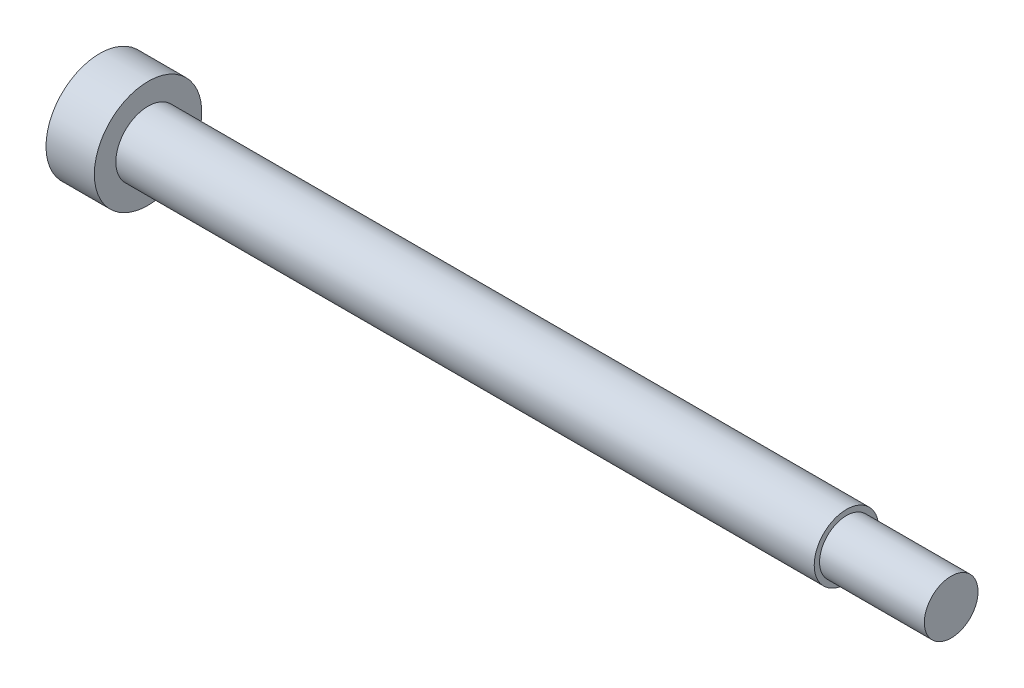
ISO-10303-21;
HEADER;
FILE_DESCRIPTION(('STEP AP214'),'2;1');
FILE_NAME('part.step','',(''),(''),'','','');
FILE_SCHEMA(('AUTOMOTIVE_DESIGN { 1 0 10303 214 1 1 1 1 }'));
ENDSEC;
DATA;
#1=APPLICATION_CONTEXT('core data for automotive mechanical design processes');
#2=APPLICATION_PROTOCOL_DEFINITION('international standard','automotive_design',2000,#1);
#3=PRODUCT_CONTEXT('',#1,'mechanical');
#4=PRODUCT('Part','Part','',(#3));
#5=PRODUCT_RELATED_PRODUCT_CATEGORY('part','',(#4));
#6=PRODUCT_DEFINITION_FORMATION('','',#4);
#7=PRODUCT_DEFINITION_CONTEXT('part definition',#1,'design');
#8=PRODUCT_DEFINITION('design','',#6,#7);
#9=PRODUCT_DEFINITION_SHAPE('','',#8);
#10=(LENGTH_UNIT() NAMED_UNIT(*) SI_UNIT(.MILLI.,.METRE.));
#11=(NAMED_UNIT(*) PLANE_ANGLE_UNIT() SI_UNIT($,.RADIAN.));
#12=(NAMED_UNIT(*) SI_UNIT($,.STERADIAN.) SOLID_ANGLE_UNIT());
#13=UNCERTAINTY_MEASURE_WITH_UNIT(LENGTH_MEASURE(1.E-05),#10,'distance_accuracy_value','');
#14=(GEOMETRIC_REPRESENTATION_CONTEXT(3) GLOBAL_UNCERTAINTY_ASSIGNED_CONTEXT((#13)) GLOBAL_UNIT_ASSIGNED_CONTEXT((#10,
#11,#12)) REPRESENTATION_CONTEXT('',''));
#15=CARTESIAN_POINT('',(0.,0.,0.));
#16=DIRECTION('',(0.,0.,1.));
#17=DIRECTION('',(1.,0.,0.));
#18=AXIS2_PLACEMENT_3D('',#15,#16,#17);
#19=CARTESIAN_POINT('',(0.,0.,0.));
#20=DIRECTION('',(1.,0.,0.));
#21=DIRECTION('',(0.,0.,-1.));
#22=AXIS2_PLACEMENT_3D('',#19,#20,#21);
#23=PLANE('',#22);
#24=DIRECTION('',(0.,-0.5,-0.866025403784439));
#25=VECTOR('',#24,1.);
#26=CARTESIAN_POINT('',(0.,2.88675134594813,0.));
#27=LINE('',#26,#25);
#28=CARTESIAN_POINT('',(0.,2.88675134594813,0.));
#29=VERTEX_POINT('',#28);
#30=CARTESIAN_POINT('',(0.,1.44337567297406,-2.5));
#31=VERTEX_POINT('',#30);
#32=EDGE_CURVE('E125',#29,#31,#27,.T.);
#33=ORIENTED_EDGE('',*,*,#32,.F.);
#34=DIRECTION('',(0.,0.5,-0.866025403784439));
#35=VECTOR('',#34,1.);
#36=CARTESIAN_POINT('',(0.,1.44337567297406,2.5));
#37=LINE('',#36,#35);
#38=CARTESIAN_POINT('',(0.,1.44337567297406,2.5));
#39=VERTEX_POINT('',#38);
#40=EDGE_CURVE('E51',#39,#29,#37,.T.);
#41=ORIENTED_EDGE('',*,*,#40,.F.);
#42=DIRECTION('',(0.,1.,0.));
#43=VECTOR('',#42,1.);
#44=CARTESIAN_POINT('',(0.,-1.44337567297407,2.5));
#45=LINE('',#44,#43);
#46=CARTESIAN_POINT('',(0.,-1.44337567297407,2.5));
#47=VERTEX_POINT('',#46);
#48=EDGE_CURVE('E134',#47,#39,#45,.T.);
#49=ORIENTED_EDGE('',*,*,#48,.F.);
#50=DIRECTION('',(0.,0.5,0.866025403784438));
#51=VECTOR('',#50,1.);
#52=CARTESIAN_POINT('',(0.,-2.88675134594813,0.));
#53=LINE('',#52,#51);
#54=CARTESIAN_POINT('',(0.,-2.88675134594813,0.));
#55=VERTEX_POINT('',#54);
#56=EDGE_CURVE('E132',#55,#47,#53,.T.);
#57=ORIENTED_EDGE('',*,*,#56,.F.);
#58=DIRECTION('',(0.,-0.5,0.866025403784439));
#59=VECTOR('',#58,1.);
#60=CARTESIAN_POINT('',(0.,-1.44337567297406,-2.5));
#61=LINE('',#60,#59);
#62=CARTESIAN_POINT('',(0.,-1.44337567297406,-2.5));
#63=VERTEX_POINT('',#62);
#64=EDGE_CURVE('E99',#63,#55,#61,.T.);
#65=ORIENTED_EDGE('',*,*,#64,.F.);
#66=DIRECTION('',(0.,-1.,0.));
#67=VECTOR('',#66,1.);
#68=CARTESIAN_POINT('',(0.,1.44337567297406,-2.5));
#69=LINE('',#68,#67);
#70=EDGE_CURVE('E128',#31,#63,#69,.T.);
#71=ORIENTED_EDGE('',*,*,#70,.F.);
#72=EDGE_LOOP('',(#33,#41,#49,#57,#65,#71));
#73=FACE_BOUND('',#72,.T.);
#74=CARTESIAN_POINT('',(0.,0.,0.));
#75=DIRECTION('',(-1.,0.,0.));
#76=DIRECTION('',(0.,0.,1.));
#77=AXIS2_PLACEMENT_3D('',#74,#75,#76);
#78=CIRCLE('',#77,5.);
#79=CARTESIAN_POINT('',(0.,0.,5.));
#80=VERTEX_POINT('',#79);
#81=EDGE_CURVE('E11',#80,#80,#78,.T.);
#82=ORIENTED_EDGE('',*,*,#81,.T.);
#83=EDGE_LOOP('',(#82));
#84=FACE_BOUND('',#83,.T.);
#85=ADVANCED_FACE('F37',(#73,#84),#23,.F.);
#86=CARTESIAN_POINT('',(0.,0.,0.));
#87=DIRECTION('',(-1.,0.,0.));
#88=DIRECTION('',(0.,0.,1.));
#89=AXIS2_PLACEMENT_3D('',#86,#87,#88);
#90=CYLINDRICAL_SURFACE('',#89,5.);
#91=ORIENTED_EDGE('',*,*,#81,.F.);
#92=EDGE_LOOP('',(#91));
#93=FACE_BOUND('',#92,.T.);
#94=CARTESIAN_POINT('',(4.5,0.,0.));
#95=DIRECTION('',(-1.,0.,0.));
#96=DIRECTION('',(0.,0.,1.));
#97=AXIS2_PLACEMENT_3D('',#94,#95,#96);
#98=CIRCLE('',#97,5.);
#99=CARTESIAN_POINT('',(4.5,0.,5.));
#100=VERTEX_POINT('',#99);
#101=EDGE_CURVE('E44',#100,#100,#98,.T.);
#102=ORIENTED_EDGE('',*,*,#101,.T.);
#103=EDGE_LOOP('',(#102));
#104=FACE_BOUND('',#103,.T.);
#105=ADVANCED_FACE('F157',(#93,#104),#90,.T.);
#106=CARTESIAN_POINT('',(4.5,5.,0.));
#107=DIRECTION('',(-1.,0.,0.));
#108=DIRECTION('',(0.,0.,1.));
#109=AXIS2_PLACEMENT_3D('',#106,#107,#108);
#110=PLANE('',#109);
#111=ORIENTED_EDGE('',*,*,#101,.F.);
#112=EDGE_LOOP('',(#111));
#113=FACE_BOUND('',#112,.T.);
#114=CARTESIAN_POINT('',(4.5,0.,0.));
#115=DIRECTION('',(-1.,0.,0.));
#116=DIRECTION('',(0.,0.,1.));
#117=AXIS2_PLACEMENT_3D('',#114,#115,#116);
#118=CIRCLE('',#117,3.);
#119=CARTESIAN_POINT('',(4.5,0.,3.));
#120=VERTEX_POINT('',#119);
#121=EDGE_CURVE('E152',#120,#120,#118,.T.);
#122=ORIENTED_EDGE('',*,*,#121,.T.);
#123=EDGE_LOOP('',(#122));
#124=FACE_BOUND('',#123,.T.);
#125=ADVANCED_FACE('F159',(#113,#124),#110,.F.);
#126=CARTESIAN_POINT('',(0.,0.,0.));
#127=DIRECTION('',(-1.,0.,0.));
#128=DIRECTION('',(0.,0.,1.));
#129=AXIS2_PLACEMENT_3D('',#126,#127,#128);
#130=CYLINDRICAL_SURFACE('',#129,3.);
#131=ORIENTED_EDGE('',*,*,#121,.F.);
#132=EDGE_LOOP('',(#131));
#133=FACE_BOUND('',#132,.T.);
#134=CARTESIAN_POINT('',(69.5,0.,0.));
#135=DIRECTION('',(-1.,0.,0.));
#136=DIRECTION('',(0.,0.,1.));
#137=AXIS2_PLACEMENT_3D('',#134,#135,#136);
#138=CIRCLE('',#137,3.);
#139=CARTESIAN_POINT('',(69.5,0.,3.));
#140=VERTEX_POINT('',#139);
#141=EDGE_CURVE('E149',#140,#140,#138,.T.);
#142=ORIENTED_EDGE('',*,*,#141,.T.);
#143=EDGE_LOOP('',(#142));
#144=FACE_BOUND('',#143,.T.);
#145=ADVANCED_FACE('F162',(#133,#144),#130,.T.);
#146=CARTESIAN_POINT('',(69.5,3.,0.));
#147=DIRECTION('',(-1.,0.,0.));
#148=DIRECTION('',(0.,0.,1.));
#149=AXIS2_PLACEMENT_3D('',#146,#147,#148);
#150=PLANE('',#149);
#151=ORIENTED_EDGE('',*,*,#141,.F.);
#152=EDGE_LOOP('',(#151));
#153=FACE_BOUND('',#152,.T.);
#154=CARTESIAN_POINT('',(69.5,0.,0.));
#155=DIRECTION('',(-1.,0.,0.));
#156=DIRECTION('',(0.,0.,1.));
#157=AXIS2_PLACEMENT_3D('',#154,#155,#156);
#158=CIRCLE('',#157,2.5);
#159=CARTESIAN_POINT('',(69.5,0.,2.5));
#160=VERTEX_POINT('',#159);
#161=EDGE_CURVE('E146',#160,#160,#158,.T.);
#162=ORIENTED_EDGE('',*,*,#161,.T.);
#163=EDGE_LOOP('',(#162));
#164=FACE_BOUND('',#163,.T.);
#165=ADVANCED_FACE('F168',(#153,#164),#150,.F.);
#166=CARTESIAN_POINT('',(0.,0.,0.));
#167=DIRECTION('',(-1.,0.,0.));
#168=DIRECTION('',(0.,0.,1.));
#169=AXIS2_PLACEMENT_3D('',#166,#167,#168);
#170=CYLINDRICAL_SURFACE('',#169,2.49999999999999);
#171=ORIENTED_EDGE('',*,*,#161,.F.);
#172=EDGE_LOOP('',(#171));
#173=FACE_BOUND('',#172,.T.);
#174=CARTESIAN_POINT('',(79.25,0.,0.));
#175=DIRECTION('',(-1.,0.,0.));
#176=DIRECTION('',(0.,0.,1.));
#177=AXIS2_PLACEMENT_3D('',#174,#175,#176);
#178=CIRCLE('',#177,2.49999999999999);
#179=CARTESIAN_POINT('',(79.25,0.,2.49999999999999));
#180=VERTEX_POINT('',#179);
#181=EDGE_CURVE('E138',#180,#180,#178,.T.);
#182=ORIENTED_EDGE('',*,*,#181,.T.);
#183=EDGE_LOOP('',(#182));
#184=FACE_BOUND('',#183,.T.);
#185=ADVANCED_FACE('F174',(#173,#184),#170,.T.);
#186=CARTESIAN_POINT('',(79.25,2.49999999999999,0.));
#187=DIRECTION('',(-1.,0.,0.));
#188=DIRECTION('',(0.,0.,1.));
#189=AXIS2_PLACEMENT_3D('',#186,#187,#188);
#190=PLANE('',#189);
#191=ORIENTED_EDGE('',*,*,#181,.F.);
#192=EDGE_LOOP('',(#191));
#193=FACE_BOUND('',#192,.T.);
#194=ADVANCED_FACE('F180',(#193),#190,.F.);
#195=CARTESIAN_POINT('',(3.,1.44337567297406,2.5));
#196=DIRECTION('',(0.,0.866025403784439,0.5));
#197=DIRECTION('',(0.,-0.5,0.866025403784439));
#198=AXIS2_PLACEMENT_3D('',#195,#196,#197);
#199=PLANE('',#198);
#200=ORIENTED_EDGE('',*,*,#40,.T.);
#201=DIRECTION('',(-1.,0.,0.));
#202=VECTOR('',#201,1.);
#203=CARTESIAN_POINT('',(3.,2.88675134594813,0.));
#204=LINE('',#203,#202);
#205=CARTESIAN_POINT('',(3.,2.88675134594813,0.));
#206=VERTEX_POINT('',#205);
#207=EDGE_CURVE('E81',#206,#29,#204,.T.);
#208=ORIENTED_EDGE('',*,*,#207,.F.);
#209=DIRECTION('',(0.,0.5,-0.866025403784439));
#210=VECTOR('',#209,1.);
#211=CARTESIAN_POINT('',(3.,1.44337567297406,2.5));
#212=LINE('',#211,#210);
#213=CARTESIAN_POINT('',(3.,1.44337567297406,2.5));
#214=VERTEX_POINT('',#213);
#215=EDGE_CURVE('E136',#214,#206,#212,.T.);
#216=ORIENTED_EDGE('',*,*,#215,.F.);
#217=DIRECTION('',(-1.,0.,0.));
#218=VECTOR('',#217,1.);
#219=CARTESIAN_POINT('',(3.,1.44337567297406,2.5));
#220=LINE('',#219,#218);
#221=EDGE_CURVE('E59',#214,#39,#220,.T.);
#222=ORIENTED_EDGE('',*,*,#221,.T.);
#223=EDGE_LOOP('',(#200,#208,#216,#222));
#224=FACE_BOUND('',#223,.T.);
#225=ADVANCED_FACE('F185',(#224),#199,.F.);
#226=CARTESIAN_POINT('',(3.,-1.44337567297407,2.5));
#227=DIRECTION('',(0.,0.,1.));
#228=DIRECTION('',(1.,0.,0.));
#229=AXIS2_PLACEMENT_3D('',#226,#227,#228);
#230=PLANE('',#229);
#231=ORIENTED_EDGE('',*,*,#48,.T.);
#232=ORIENTED_EDGE('',*,*,#221,.F.);
#233=DIRECTION('',(0.,1.,0.));
#234=VECTOR('',#233,1.);
#235=CARTESIAN_POINT('',(3.,-1.44337567297407,2.5));
#236=LINE('',#235,#234);
#237=CARTESIAN_POINT('',(3.,-1.44337567297407,2.5));
#238=VERTEX_POINT('',#237);
#239=EDGE_CURVE('E111',#238,#214,#236,.T.);
#240=ORIENTED_EDGE('',*,*,#239,.F.);
#241=DIRECTION('',(-1.,0.,0.));
#242=VECTOR('',#241,1.);
#243=CARTESIAN_POINT('',(3.,-1.44337567297407,2.5));
#244=LINE('',#243,#242);
#245=EDGE_CURVE('E103',#238,#47,#244,.T.);
#246=ORIENTED_EDGE('',*,*,#245,.T.);
#247=EDGE_LOOP('',(#231,#232,#240,#246));
#248=FACE_BOUND('',#247,.T.);
#249=ADVANCED_FACE('F190',(#248),#230,.F.);
#250=CARTESIAN_POINT('',(3.,-2.88675134594813,0.));
#251=DIRECTION('',(0.,-0.866025403784439,0.5));
#252=DIRECTION('',(0.,-0.5,-0.866025403784439));
#253=AXIS2_PLACEMENT_3D('',#250,#251,#252);
#254=PLANE('',#253);
#255=ORIENTED_EDGE('',*,*,#56,.T.);
#256=ORIENTED_EDGE('',*,*,#245,.F.);
#257=DIRECTION('',(0.,0.5,0.866025403784438));
#258=VECTOR('',#257,1.);
#259=CARTESIAN_POINT('',(3.,-2.88675134594813,0.));
#260=LINE('',#259,#258);
#261=CARTESIAN_POINT('',(3.,-2.88675134594813,0.));
#262=VERTEX_POINT('',#261);
#263=EDGE_CURVE('E107',#262,#238,#260,.T.);
#264=ORIENTED_EDGE('',*,*,#263,.F.);
#265=DIRECTION('',(-1.,0.,0.));
#266=VECTOR('',#265,1.);
#267=CARTESIAN_POINT('',(3.,-2.88675134594813,0.));
#268=LINE('',#267,#266);
#269=EDGE_CURVE('E92',#262,#55,#268,.T.);
#270=ORIENTED_EDGE('',*,*,#269,.T.);
#271=EDGE_LOOP('',(#255,#256,#264,#270));
#272=FACE_BOUND('',#271,.T.);
#273=ADVANCED_FACE('F108',(#272),#254,.F.);
#274=CARTESIAN_POINT('',(3.,-1.44337567297406,-2.5));
#275=DIRECTION('',(0.,-0.866025403784439,-0.5));
#276=DIRECTION('',(0.,0.5,-0.866025403784439));
#277=AXIS2_PLACEMENT_3D('',#274,#275,#276);
#278=PLANE('',#277);
#279=ORIENTED_EDGE('',*,*,#64,.T.);
#280=ORIENTED_EDGE('',*,*,#269,.F.);
#281=DIRECTION('',(0.,-0.5,0.866025403784439));
#282=VECTOR('',#281,1.);
#283=CARTESIAN_POINT('',(3.,-1.44337567297406,-2.5));
#284=LINE('',#283,#282);
#285=CARTESIAN_POINT('',(3.,-1.44337567297406,-2.5));
#286=VERTEX_POINT('',#285);
#287=EDGE_CURVE('E96',#286,#262,#284,.T.);
#288=ORIENTED_EDGE('',*,*,#287,.F.);
#289=DIRECTION('',(-1.,0.,0.));
#290=VECTOR('',#289,1.);
#291=CARTESIAN_POINT('',(3.,-1.44337567297406,-2.5));
#292=LINE('',#291,#290);
#293=EDGE_CURVE('E104',#286,#63,#292,.T.);
#294=ORIENTED_EDGE('',*,*,#293,.T.);
#295=EDGE_LOOP('',(#279,#280,#288,#294));
#296=FACE_BOUND('',#295,.T.);
#297=ADVANCED_FACE('F94',(#296),#278,.F.);
#298=CARTESIAN_POINT('',(3.,1.44337567297406,-2.5));
#299=DIRECTION('',(0.,0.,-1.));
#300=DIRECTION('',(-1.,0.,0.));
#301=AXIS2_PLACEMENT_3D('',#298,#299,#300);
#302=PLANE('',#301);
#303=ORIENTED_EDGE('',*,*,#70,.T.);
#304=ORIENTED_EDGE('',*,*,#293,.F.);
#305=DIRECTION('',(0.,-1.,0.));
#306=VECTOR('',#305,1.);
#307=CARTESIAN_POINT('',(3.,1.44337567297406,-2.5));
#308=LINE('',#307,#306);
#309=CARTESIAN_POINT('',(3.,1.44337567297406,-2.5));
#310=VERTEX_POINT('',#309);
#311=EDGE_CURVE('E117',#310,#286,#308,.T.);
#312=ORIENTED_EDGE('',*,*,#311,.F.);
#313=DIRECTION('',(-1.,0.,0.));
#314=VECTOR('',#313,1.);
#315=CARTESIAN_POINT('',(3.,1.44337567297406,-2.5));
#316=LINE('',#315,#314);
#317=EDGE_CURVE('E141',#310,#31,#316,.T.);
#318=ORIENTED_EDGE('',*,*,#317,.T.);
#319=EDGE_LOOP('',(#303,#304,#312,#318));
#320=FACE_BOUND('',#319,.T.);
#321=ADVANCED_FACE('F216',(#320),#302,.F.);
#322=CARTESIAN_POINT('',(3.,2.88675134594813,0.));
#323=DIRECTION('',(0.,0.866025403784439,-0.5));
#324=DIRECTION('',(0.,0.5,0.866025403784439));
#325=AXIS2_PLACEMENT_3D('',#322,#323,#324);
#326=PLANE('',#325);
#327=ORIENTED_EDGE('',*,*,#32,.T.);
#328=ORIENTED_EDGE('',*,*,#317,.F.);
#329=DIRECTION('',(0.,-0.5,-0.866025403784439));
#330=VECTOR('',#329,1.);
#331=CARTESIAN_POINT('',(3.,2.88675134594813,0.));
#332=LINE('',#331,#330);
#333=EDGE_CURVE('E119',#206,#310,#332,.T.);
#334=ORIENTED_EDGE('',*,*,#333,.F.);
#335=ORIENTED_EDGE('',*,*,#207,.T.);
#336=EDGE_LOOP('',(#327,#328,#334,#335));
#337=FACE_BOUND('',#336,.T.);
#338=ADVANCED_FACE('F204',(#337),#326,.F.);
#339=CARTESIAN_POINT('',(3.,0.,0.));
#340=DIRECTION('',(-1.,0.,0.));
#341=DIRECTION('',(0.,0.,1.));
#342=AXIS2_PLACEMENT_3D('',#339,#340,#341);
#343=PLANE('',#342);
#344=ORIENTED_EDGE('',*,*,#215,.T.);
#345=ORIENTED_EDGE('',*,*,#333,.T.);
#346=ORIENTED_EDGE('',*,*,#311,.T.);
#347=ORIENTED_EDGE('',*,*,#287,.T.);
#348=ORIENTED_EDGE('',*,*,#263,.T.);
#349=ORIENTED_EDGE('',*,*,#239,.T.);
#350=EDGE_LOOP('',(#344,#345,#346,#347,#348,#349));
#351=FACE_BOUND('',#350,.T.);
#352=ADVANCED_FACE('F114',(#351),#343,.T.);
#353=CLOSED_SHELL('',(#85,#105,#125,#145,#165,#185,#194,#225,#249,#273,#297,#321,#338,#352));
#354=MANIFOLD_SOLID_BREP('B2',#353);
#355=ADVANCED_BREP_SHAPE_REPRESENTATION('',(#18,#354),#14);
#356=SHAPE_DEFINITION_REPRESENTATION(#9,#355);
ENDSEC;
END-ISO-10303-21;
